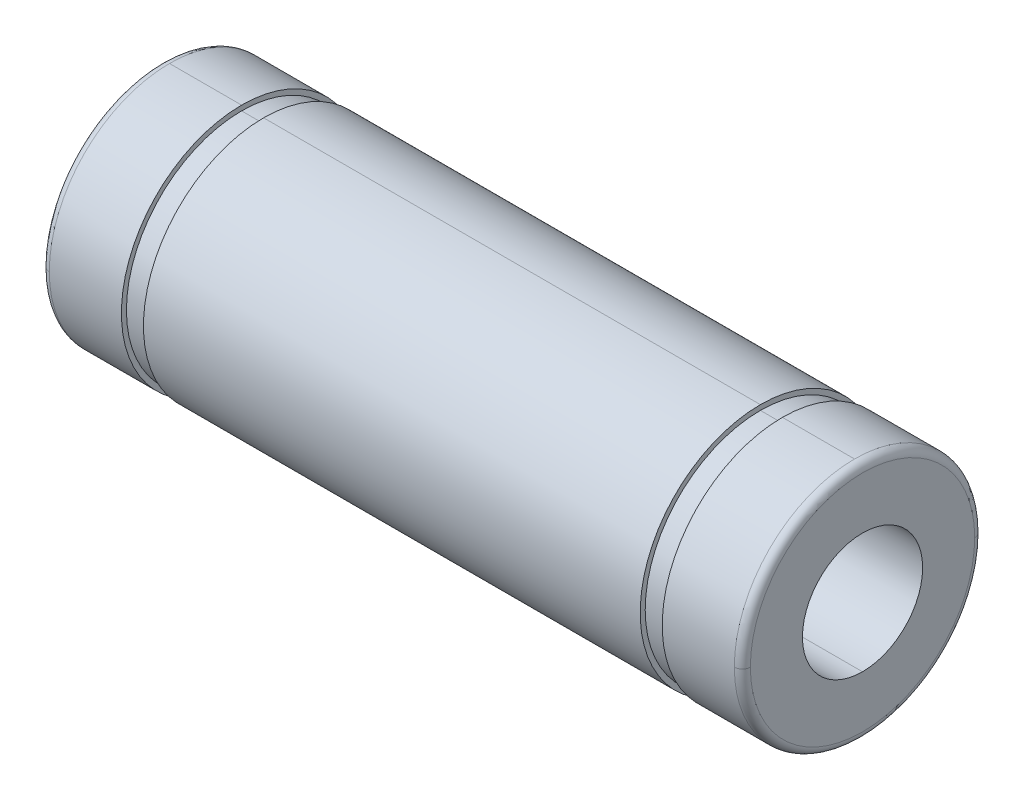
ISO-10303-21;
HEADER;
FILE_DESCRIPTION(('STEP AP214'),'2;1');
FILE_NAME('part.step','',(''),(''),'','','');
FILE_SCHEMA(('AUTOMOTIVE_DESIGN { 1 0 10303 214 1 1 1 1 }'));
ENDSEC;
DATA;
#1=APPLICATION_CONTEXT('core data for automotive mechanical design processes');
#2=APPLICATION_PROTOCOL_DEFINITION('international standard','automotive_design',2000,#1);
#3=PRODUCT_CONTEXT('',#1,'mechanical');
#4=PRODUCT('Part','Part','',(#3));
#5=PRODUCT_RELATED_PRODUCT_CATEGORY('part','',(#4));
#6=PRODUCT_DEFINITION_FORMATION('','',#4);
#7=PRODUCT_DEFINITION_CONTEXT('part definition',#1,'design');
#8=PRODUCT_DEFINITION('design','',#6,#7);
#9=PRODUCT_DEFINITION_SHAPE('','',#8);
#10=(LENGTH_UNIT() NAMED_UNIT(*) SI_UNIT(.MILLI.,.METRE.));
#11=(NAMED_UNIT(*) PLANE_ANGLE_UNIT() SI_UNIT($,.RADIAN.));
#12=(NAMED_UNIT(*) SI_UNIT($,.STERADIAN.) SOLID_ANGLE_UNIT());
#13=UNCERTAINTY_MEASURE_WITH_UNIT(LENGTH_MEASURE(1.E-05),#10,'distance_accuracy_value','');
#14=(GEOMETRIC_REPRESENTATION_CONTEXT(3) GLOBAL_UNCERTAINTY_ASSIGNED_CONTEXT((#13)) GLOBAL_UNIT_ASSIGNED_CONTEXT((#10,
#11,#12)) REPRESENTATION_CONTEXT('',''));
#15=CARTESIAN_POINT('',(0.,0.,0.));
#16=DIRECTION('',(0.,0.,1.));
#17=DIRECTION('',(1.,0.,0.));
#18=AXIS2_PLACEMENT_3D('',#15,#16,#17);
#19=CARTESIAN_POINT('',(-17.1,0.,0.));
#20=DIRECTION('',(1.,0.,0.));
#21=DIRECTION('',(0.,0.,-1.));
#22=AXIS2_PLACEMENT_3D('',#19,#20,#21);
#23=TOROIDAL_SURFACE('',#22,5.6,0.4);
#24=CARTESIAN_POINT('',(-17.1,0.,-5.6));
#25=DIRECTION('',(0.,-1.,0.));
#26=DIRECTION('',(0.,0.,-1.));
#27=AXIS2_PLACEMENT_3D('',#24,#25,#26);
#28=CIRCLE('',#27,0.4);
#29=CARTESIAN_POINT('',(-17.5,0.,-5.6));
#30=VERTEX_POINT('',#29);
#31=CARTESIAN_POINT('',(-17.1,0.,-6.));
#32=VERTEX_POINT('',#31);
#33=EDGE_CURVE('E222',#30,#32,#28,.T.);
#34=ORIENTED_EDGE('',*,*,#33,.T.);
#35=CARTESIAN_POINT('',(-17.1,0.,0.));
#36=DIRECTION('',(1.,0.,0.));
#37=DIRECTION('',(0.,1.,0.));
#38=AXIS2_PLACEMENT_3D('',#35,#36,#37);
#39=CIRCLE('',#38,6.);
#40=CARTESIAN_POINT('',(-17.1,-6.,0.));
#41=VERTEX_POINT('',#40);
#42=EDGE_CURVE('E70',#41,#32,#39,.T.);
#43=ORIENTED_EDGE('',*,*,#42,.F.);
#44=CARTESIAN_POINT('',(-17.1,0.,0.));
#45=DIRECTION('',(1.,0.,0.));
#46=DIRECTION('',(0.,1.,0.));
#47=AXIS2_PLACEMENT_3D('',#44,#45,#46);
#48=CIRCLE('',#47,6.);
#49=CARTESIAN_POINT('',(-17.1,0.,6.));
#50=VERTEX_POINT('',#49);
#51=EDGE_CURVE('E305',#50,#41,#48,.T.);
#52=ORIENTED_EDGE('',*,*,#51,.F.);
#53=CARTESIAN_POINT('',(-17.1,0.,5.6));
#54=DIRECTION('',(0.,-1.,0.));
#55=DIRECTION('',(0.,0.,1.));
#56=AXIS2_PLACEMENT_3D('',#53,#54,#55);
#57=CIRCLE('',#56,0.4);
#58=CARTESIAN_POINT('',(-17.5,0.,5.6));
#59=VERTEX_POINT('',#58);
#60=EDGE_CURVE('E304',#50,#59,#57,.T.);
#61=ORIENTED_EDGE('',*,*,#60,.T.);
#62=CARTESIAN_POINT('',(-17.5,0.,0.));
#63=DIRECTION('',(1.,0.,0.));
#64=DIRECTION('',(0.,1.,0.));
#65=AXIS2_PLACEMENT_3D('',#62,#63,#64);
#66=CIRCLE('',#65,5.6);
#67=EDGE_CURVE('E11',#59,#30,#66,.T.);
#68=ORIENTED_EDGE('',*,*,#67,.T.);
#69=EDGE_LOOP('',(#34,#43,#52,#61,#68));
#70=FACE_BOUND('',#69,.T.);
#71=ADVANCED_FACE('F16',(#70),#23,.T.);
#72=CARTESIAN_POINT('',(-17.5,4.3,0.));
#73=DIRECTION('',(-1.,0.,0.));
#74=DIRECTION('',(0.,0.,1.));
#75=AXIS2_PLACEMENT_3D('',#72,#73,#74);
#76=PLANE('',#75);
#77=CARTESIAN_POINT('',(-17.5,0.,0.));
#78=DIRECTION('',(1.,0.,0.));
#79=DIRECTION('',(0.,1.,0.));
#80=AXIS2_PLACEMENT_3D('',#77,#78,#79);
#81=CIRCLE('',#80,3.);
#82=CARTESIAN_POINT('',(-17.5,3.,0.));
#83=VERTEX_POINT('',#82);
#84=CARTESIAN_POINT('',(-17.5,-3.,0.));
#85=VERTEX_POINT('',#84);
#86=EDGE_CURVE('E27',#83,#85,#81,.T.);
#87=ORIENTED_EDGE('',*,*,#86,.T.);
#88=CARTESIAN_POINT('',(-17.5,0.,0.));
#89=DIRECTION('',(1.,0.,0.));
#90=DIRECTION('',(0.,1.,0.));
#91=AXIS2_PLACEMENT_3D('',#88,#89,#90);
#92=CIRCLE('',#91,3.);
#93=EDGE_CURVE('E291',#85,#83,#92,.T.);
#94=ORIENTED_EDGE('',*,*,#93,.T.);
#95=EDGE_LOOP('',(#87,#94));
#96=FACE_BOUND('',#95,.T.);
#97=CARTESIAN_POINT('',(-17.5,0.,0.));
#98=DIRECTION('',(1.,0.,0.));
#99=DIRECTION('',(0.,1.,0.));
#100=AXIS2_PLACEMENT_3D('',#97,#98,#99);
#101=CIRCLE('',#100,5.6);
#102=CARTESIAN_POINT('',(-17.5,5.6,0.));
#103=VERTEX_POINT('',#102);
#104=EDGE_CURVE('E221',#103,#59,#101,.T.);
#105=ORIENTED_EDGE('',*,*,#104,.F.);
#106=CARTESIAN_POINT('',(-17.5,0.,0.));
#107=DIRECTION('',(1.,0.,0.));
#108=DIRECTION('',(0.,1.,0.));
#109=AXIS2_PLACEMENT_3D('',#106,#107,#108);
#110=CIRCLE('',#109,5.6);
#111=EDGE_CURVE('E218',#30,#103,#110,.T.);
#112=ORIENTED_EDGE('',*,*,#111,.F.);
#113=ORIENTED_EDGE('',*,*,#67,.F.);
#114=EDGE_LOOP('',(#105,#112,#113));
#115=FACE_BOUND('',#114,.T.);
#116=ADVANCED_FACE('F423',(#96,#115),#76,.T.);
#117=CARTESIAN_POINT('',(0.,0.,0.));
#118=DIRECTION('',(1.,0.,0.));
#119=DIRECTION('',(0.,1.,0.));
#120=AXIS2_PLACEMENT_3D('',#117,#118,#119);
#121=CYLINDRICAL_SURFACE('',#120,3.);
#122=DIRECTION('',(1.,0.,0.));
#123=VECTOR('',#122,1.);
#124=CARTESIAN_POINT('',(0.,3.,0.));
#125=LINE('',#124,#123);
#126=CARTESIAN_POINT('',(17.5,3.,0.));
#127=VERTEX_POINT('',#126);
#128=EDGE_CURVE('E295',#83,#127,#125,.T.);
#129=ORIENTED_EDGE('',*,*,#128,.T.);
#130=CARTESIAN_POINT('',(17.5,0.,0.));
#131=DIRECTION('',(1.,0.,0.));
#132=DIRECTION('',(0.,1.,0.));
#133=AXIS2_PLACEMENT_3D('',#130,#131,#132);
#134=CIRCLE('',#133,3.);
#135=CARTESIAN_POINT('',(17.5,-3.,0.));
#136=VERTEX_POINT('',#135);
#137=EDGE_CURVE('E281',#127,#136,#134,.T.);
#138=ORIENTED_EDGE('',*,*,#137,.T.);
#139=DIRECTION('',(-1.,0.,0.));
#140=VECTOR('',#139,1.);
#141=CARTESIAN_POINT('',(0.,-3.,0.));
#142=LINE('',#141,#140);
#143=EDGE_CURVE('E20',#136,#85,#142,.T.);
#144=ORIENTED_EDGE('',*,*,#143,.T.);
#145=ORIENTED_EDGE('',*,*,#86,.F.);
#146=EDGE_LOOP('',(#129,#138,#144,#145));
#147=FACE_BOUND('',#146,.T.);
#148=ADVANCED_FACE('F427',(#147),#121,.F.);
#149=CARTESIAN_POINT('',(17.5,4.3,0.));
#150=DIRECTION('',(1.,0.,0.));
#151=DIRECTION('',(0.,1.,0.));
#152=AXIS2_PLACEMENT_3D('',#149,#150,#151);
#153=PLANE('',#152);
#154=ORIENTED_EDGE('',*,*,#137,.F.);
#155=CARTESIAN_POINT('',(17.5,0.,0.));
#156=DIRECTION('',(1.,0.,0.));
#157=DIRECTION('',(0.,1.,0.));
#158=AXIS2_PLACEMENT_3D('',#155,#156,#157);
#159=CIRCLE('',#158,3.);
#160=EDGE_CURVE('E246',#136,#127,#159,.T.);
#161=ORIENTED_EDGE('',*,*,#160,.F.);
#162=EDGE_LOOP('',(#154,#161));
#163=FACE_BOUND('',#162,.T.);
#164=CARTESIAN_POINT('',(17.5,0.,0.));
#165=DIRECTION('',(1.,0.,0.));
#166=DIRECTION('',(0.,1.,0.));
#167=AXIS2_PLACEMENT_3D('',#164,#165,#166);
#168=CIRCLE('',#167,5.6);
#169=CARTESIAN_POINT('',(17.5,5.6,0.));
#170=VERTEX_POINT('',#169);
#171=CARTESIAN_POINT('',(17.5,0.,5.6));
#172=VERTEX_POINT('',#171);
#173=EDGE_CURVE('E377',#170,#172,#168,.T.);
#174=ORIENTED_EDGE('',*,*,#173,.T.);
#175=CARTESIAN_POINT('',(17.5,0.,0.));
#176=DIRECTION('',(1.,0.,0.));
#177=DIRECTION('',(0.,1.,0.));
#178=AXIS2_PLACEMENT_3D('',#175,#176,#177);
#179=CIRCLE('',#178,5.6);
#180=CARTESIAN_POINT('',(17.5,0.,-5.6));
#181=VERTEX_POINT('',#180);
#182=EDGE_CURVE('E278',#172,#181,#179,.T.);
#183=ORIENTED_EDGE('',*,*,#182,.T.);
#184=CARTESIAN_POINT('',(17.5,0.,0.));
#185=DIRECTION('',(1.,0.,0.));
#186=DIRECTION('',(0.,1.,0.));
#187=AXIS2_PLACEMENT_3D('',#184,#185,#186);
#188=CIRCLE('',#187,5.6);
#189=EDGE_CURVE('E374',#181,#170,#188,.T.);
#190=ORIENTED_EDGE('',*,*,#189,.T.);
#191=EDGE_LOOP('',(#174,#183,#190));
#192=FACE_BOUND('',#191,.T.);
#193=ADVANCED_FACE('F18',(#163,#192),#153,.T.);
#194=CARTESIAN_POINT('',(17.1,0.,0.));
#195=DIRECTION('',(1.,0.,0.));
#196=DIRECTION('',(0.,0.,-1.));
#197=AXIS2_PLACEMENT_3D('',#194,#195,#196);
#198=TOROIDAL_SURFACE('',#197,5.6,0.4);
#199=CARTESIAN_POINT('',(17.1,0.,-5.6));
#200=DIRECTION('',(0.,-1.,0.));
#201=DIRECTION('',(0.,0.,-1.));
#202=AXIS2_PLACEMENT_3D('',#199,#200,#201);
#203=CIRCLE('',#202,0.4);
#204=CARTESIAN_POINT('',(17.1,0.,-6.));
#205=VERTEX_POINT('',#204);
#206=EDGE_CURVE('E250',#205,#181,#203,.T.);
#207=ORIENTED_EDGE('',*,*,#206,.T.);
#208=ORIENTED_EDGE('',*,*,#182,.F.);
#209=CARTESIAN_POINT('',(17.1,0.,5.6));
#210=DIRECTION('',(0.,-1.,0.));
#211=DIRECTION('',(0.,0.,1.));
#212=AXIS2_PLACEMENT_3D('',#209,#210,#211);
#213=CIRCLE('',#212,0.4);
#214=CARTESIAN_POINT('',(17.1,0.,6.));
#215=VERTEX_POINT('',#214);
#216=EDGE_CURVE('E244',#172,#215,#213,.T.);
#217=ORIENTED_EDGE('',*,*,#216,.T.);
#218=CARTESIAN_POINT('',(17.1,0.,0.));
#219=DIRECTION('',(1.,0.,0.));
#220=DIRECTION('',(0.,1.,0.));
#221=AXIS2_PLACEMENT_3D('',#218,#219,#220);
#222=CIRCLE('',#221,6.);
#223=CARTESIAN_POINT('',(17.1,-6.,0.));
#224=VERTEX_POINT('',#223);
#225=EDGE_CURVE('E201',#215,#224,#222,.T.);
#226=ORIENTED_EDGE('',*,*,#225,.T.);
#227=CARTESIAN_POINT('',(17.1,0.,0.));
#228=DIRECTION('',(1.,0.,0.));
#229=DIRECTION('',(0.,1.,0.));
#230=AXIS2_PLACEMENT_3D('',#227,#228,#229);
#231=CIRCLE('',#230,6.);
#232=EDGE_CURVE('E168',#224,#205,#231,.T.);
#233=ORIENTED_EDGE('',*,*,#232,.T.);
#234=EDGE_LOOP('',(#207,#208,#217,#226,#233));
#235=FACE_BOUND('',#234,.T.);
#236=ADVANCED_FACE('F405',(#235),#198,.T.);
#237=CARTESIAN_POINT('',(0.,0.,0.));
#238=DIRECTION('',(1.,0.,0.));
#239=DIRECTION('',(0.,1.,0.));
#240=AXIS2_PLACEMENT_3D('',#237,#238,#239);
#241=CYLINDRICAL_SURFACE('',#240,6.);
#242=DIRECTION('',(1.,0.,0.));
#243=VECTOR('',#242,1.);
#244=CARTESIAN_POINT('',(-15.3,6.,0.));
#245=LINE('',#244,#243);
#246=CARTESIAN_POINT('',(-17.1,6.,0.));
#247=VERTEX_POINT('',#246);
#248=CARTESIAN_POINT('',(-13.5,6.,0.));
#249=VERTEX_POINT('',#248);
#250=EDGE_CURVE('E310',#247,#249,#245,.T.);
#251=ORIENTED_EDGE('',*,*,#250,.T.);
#252=CARTESIAN_POINT('',(-13.5,0.,0.));
#253=DIRECTION('',(-1.,0.,0.));
#254=DIRECTION('',(0.,1.,0.));
#255=AXIS2_PLACEMENT_3D('',#252,#253,#254);
#256=CIRCLE('',#255,6.);
#257=CARTESIAN_POINT('',(-13.5,-6.,0.));
#258=VERTEX_POINT('',#257);
#259=EDGE_CURVE('E84',#249,#258,#256,.T.);
#260=ORIENTED_EDGE('',*,*,#259,.T.);
#261=DIRECTION('',(-1.,0.,0.));
#262=VECTOR('',#261,1.);
#263=CARTESIAN_POINT('',(-15.3,-6.,0.));
#264=LINE('',#263,#262);
#265=EDGE_CURVE('E309',#258,#41,#264,.T.);
#266=ORIENTED_EDGE('',*,*,#265,.T.);
#267=ORIENTED_EDGE('',*,*,#42,.T.);
#268=CARTESIAN_POINT('',(-17.1,0.,0.));
#269=DIRECTION('',(1.,0.,0.));
#270=DIRECTION('',(0.,1.,0.));
#271=AXIS2_PLACEMENT_3D('',#268,#269,#270);
#272=CIRCLE('',#271,6.);
#273=EDGE_CURVE('E303',#32,#247,#272,.T.);
#274=ORIENTED_EDGE('',*,*,#273,.T.);
#275=EDGE_LOOP('',(#251,#260,#266,#267,#274));
#276=FACE_BOUND('',#275,.T.);
#277=ADVANCED_FACE('F435',(#276),#241,.T.);
#278=CARTESIAN_POINT('',(0.,0.,0.));
#279=DIRECTION('',(1.,0.,0.));
#280=DIRECTION('',(0.,1.,0.));
#281=AXIS2_PLACEMENT_3D('',#278,#279,#280);
#282=CYLINDRICAL_SURFACE('',#281,6.);
#283=DIRECTION('',(1.,0.,0.));
#284=VECTOR('',#283,1.);
#285=CARTESIAN_POINT('',(0.,6.,0.));
#286=LINE('',#285,#284);
#287=CARTESIAN_POINT('',(-12.4,6.,0.));
#288=VERTEX_POINT('',#287);
#289=CARTESIAN_POINT('',(12.4,6.,0.));
#290=VERTEX_POINT('',#289);
#291=EDGE_CURVE('E256',#288,#290,#286,.T.);
#292=ORIENTED_EDGE('',*,*,#291,.T.);
#293=CARTESIAN_POINT('',(12.4,0.,0.));
#294=DIRECTION('',(-1.,0.,0.));
#295=DIRECTION('',(0.,1.,0.));
#296=AXIS2_PLACEMENT_3D('',#293,#294,#295);
#297=CIRCLE('',#296,6.);
#298=CARTESIAN_POINT('',(12.4,-6.,0.));
#299=VERTEX_POINT('',#298);
#300=EDGE_CURVE('E187',#290,#299,#297,.T.);
#301=ORIENTED_EDGE('',*,*,#300,.T.);
#302=DIRECTION('',(-1.,0.,0.));
#303=VECTOR('',#302,1.);
#304=CARTESIAN_POINT('',(0.,-6.,0.));
#305=LINE('',#304,#303);
#306=CARTESIAN_POINT('',(-12.4,-6.,0.));
#307=VERTEX_POINT('',#306);
#308=EDGE_CURVE('E211',#299,#307,#305,.T.);
#309=ORIENTED_EDGE('',*,*,#308,.T.);
#310=CARTESIAN_POINT('',(-12.4,0.,0.));
#311=DIRECTION('',(1.,0.,0.));
#312=DIRECTION('',(0.,1.,0.));
#313=AXIS2_PLACEMENT_3D('',#310,#311,#312);
#314=CIRCLE('',#313,6.);
#315=EDGE_CURVE('E214',#307,#288,#314,.T.);
#316=ORIENTED_EDGE('',*,*,#315,.T.);
#317=EDGE_LOOP('',(#292,#301,#309,#316));
#318=FACE_BOUND('',#317,.T.);
#319=ADVANCED_FACE('F438',(#318),#282,.T.);
#320=CARTESIAN_POINT('',(0.,0.,0.));
#321=DIRECTION('',(1.,0.,0.));
#322=DIRECTION('',(0.,1.,0.));
#323=AXIS2_PLACEMENT_3D('',#320,#321,#322);
#324=CYLINDRICAL_SURFACE('',#323,6.);
#325=DIRECTION('',(1.,0.,0.));
#326=VECTOR('',#325,1.);
#327=CARTESIAN_POINT('',(15.3,6.,0.));
#328=LINE('',#327,#326);
#329=CARTESIAN_POINT('',(13.5,6.,0.));
#330=VERTEX_POINT('',#329);
#331=CARTESIAN_POINT('',(17.1,6.,0.));
#332=VERTEX_POINT('',#331);
#333=EDGE_CURVE('E231',#330,#332,#328,.T.);
#334=ORIENTED_EDGE('',*,*,#333,.T.);
#335=CARTESIAN_POINT('',(17.1,0.,0.));
#336=DIRECTION('',(1.,0.,0.));
#337=DIRECTION('',(0.,1.,0.));
#338=AXIS2_PLACEMENT_3D('',#335,#336,#337);
#339=CIRCLE('',#338,6.);
#340=EDGE_CURVE('E288',#205,#332,#339,.T.);
#341=ORIENTED_EDGE('',*,*,#340,.F.);
#342=ORIENTED_EDGE('',*,*,#232,.F.);
#343=DIRECTION('',(-1.,0.,0.));
#344=VECTOR('',#343,1.);
#345=CARTESIAN_POINT('',(15.3,-6.,0.));
#346=LINE('',#345,#344);
#347=CARTESIAN_POINT('',(13.5,-6.,0.));
#348=VERTEX_POINT('',#347);
#349=EDGE_CURVE('E207',#224,#348,#346,.T.);
#350=ORIENTED_EDGE('',*,*,#349,.T.);
#351=CARTESIAN_POINT('',(13.5,0.,0.));
#352=DIRECTION('',(1.,0.,0.));
#353=DIRECTION('',(0.,1.,0.));
#354=AXIS2_PLACEMENT_3D('',#351,#352,#353);
#355=CIRCLE('',#354,6.);
#356=EDGE_CURVE('E217',#348,#330,#355,.T.);
#357=ORIENTED_EDGE('',*,*,#356,.T.);
#358=EDGE_LOOP('',(#334,#341,#342,#350,#357));
#359=FACE_BOUND('',#358,.T.);
#360=ADVANCED_FACE('F406',(#359),#324,.T.);
#361=CARTESIAN_POINT('',(13.5,5.875,0.));
#362=DIRECTION('',(1.,0.,0.));
#363=DIRECTION('',(0.,1.,0.));
#364=AXIS2_PLACEMENT_3D('',#361,#362,#363);
#365=PLANE('',#364);
#366=CARTESIAN_POINT('',(13.5,0.,0.));
#367=DIRECTION('',(1.,0.,0.));
#368=DIRECTION('',(0.,1.,0.));
#369=AXIS2_PLACEMENT_3D('',#366,#367,#368);
#370=CIRCLE('',#369,5.75);
#371=CARTESIAN_POINT('',(13.5,5.75,0.));
#372=VERTEX_POINT('',#371);
#373=CARTESIAN_POINT('',(13.5,-5.75,0.));
#374=VERTEX_POINT('',#373);
#375=EDGE_CURVE('E177',#372,#374,#370,.T.);
#376=ORIENTED_EDGE('',*,*,#375,.T.);
#377=CARTESIAN_POINT('',(13.5,0.,0.));
#378=DIRECTION('',(1.,0.,0.));
#379=DIRECTION('',(0.,1.,0.));
#380=AXIS2_PLACEMENT_3D('',#377,#378,#379);
#381=CIRCLE('',#380,5.75);
#382=EDGE_CURVE('E190',#374,#372,#381,.T.);
#383=ORIENTED_EDGE('',*,*,#382,.T.);
#384=EDGE_LOOP('',(#376,#383));
#385=FACE_BOUND('',#384,.T.);
#386=CARTESIAN_POINT('',(13.5,0.,0.));
#387=DIRECTION('',(1.,0.,0.));
#388=DIRECTION('',(0.,1.,0.));
#389=AXIS2_PLACEMENT_3D('',#386,#387,#388);
#390=CIRCLE('',#389,6.);
#391=EDGE_CURVE('E224',#330,#348,#390,.T.);
#392=ORIENTED_EDGE('',*,*,#391,.F.);
#393=ORIENTED_EDGE('',*,*,#356,.F.);
#394=EDGE_LOOP('',(#392,#393));
#395=FACE_BOUND('',#394,.T.);
#396=ADVANCED_FACE('F191',(#385,#395),#365,.F.);
#397=CARTESIAN_POINT('',(12.4,5.875,0.));
#398=DIRECTION('',(-1.,0.,0.));
#399=DIRECTION('',(0.,0.,1.));
#400=AXIS2_PLACEMENT_3D('',#397,#398,#399);
#401=PLANE('',#400);
#402=CARTESIAN_POINT('',(12.4,0.,0.));
#403=DIRECTION('',(1.,0.,0.));
#404=DIRECTION('',(0.,1.,0.));
#405=AXIS2_PLACEMENT_3D('',#402,#403,#404);
#406=CIRCLE('',#405,5.75);
#407=CARTESIAN_POINT('',(12.4,5.75,0.));
#408=VERTEX_POINT('',#407);
#409=CARTESIAN_POINT('',(12.4,-5.75,0.));
#410=VERTEX_POINT('',#409);
#411=EDGE_CURVE('E188',#408,#410,#406,.T.);
#412=ORIENTED_EDGE('',*,*,#411,.F.);
#413=CARTESIAN_POINT('',(12.4,0.,0.));
#414=DIRECTION('',(1.,0.,0.));
#415=DIRECTION('',(0.,1.,0.));
#416=AXIS2_PLACEMENT_3D('',#413,#414,#415);
#417=CIRCLE('',#416,5.75);
#418=EDGE_CURVE('E199',#410,#408,#417,.T.);
#419=ORIENTED_EDGE('',*,*,#418,.F.);
#420=EDGE_LOOP('',(#412,#419));
#421=FACE_BOUND('',#420,.T.);
#422=ORIENTED_EDGE('',*,*,#300,.F.);
#423=CARTESIAN_POINT('',(12.4,0.,0.));
#424=DIRECTION('',(-1.,0.,0.));
#425=DIRECTION('',(0.,1.,0.));
#426=AXIS2_PLACEMENT_3D('',#423,#424,#425);
#427=CIRCLE('',#426,6.);
#428=EDGE_CURVE('E240',#299,#290,#427,.T.);
#429=ORIENTED_EDGE('',*,*,#428,.F.);
#430=EDGE_LOOP('',(#422,#429));
#431=FACE_BOUND('',#430,.T.);
#432=ADVANCED_FACE('F433',(#421,#431),#401,.F.);
#433=CARTESIAN_POINT('',(12.95,0.,0.));
#434=DIRECTION('',(1.,0.,0.));
#435=DIRECTION('',(0.,1.,0.));
#436=AXIS2_PLACEMENT_3D('',#433,#434,#435);
#437=CYLINDRICAL_SURFACE('',#436,5.75);
#438=DIRECTION('',(-1.,0.,0.));
#439=VECTOR('',#438,1.);
#440=CARTESIAN_POINT('',(12.95,5.75,0.));
#441=LINE('',#440,#439);
#442=EDGE_CURVE('E181',#372,#408,#441,.T.);
#443=ORIENTED_EDGE('',*,*,#442,.T.);
#444=ORIENTED_EDGE('',*,*,#411,.T.);
#445=DIRECTION('',(1.,0.,0.));
#446=VECTOR('',#445,1.);
#447=CARTESIAN_POINT('',(12.95,-5.75,0.));
#448=LINE('',#447,#446);
#449=EDGE_CURVE('E183',#410,#374,#448,.T.);
#450=ORIENTED_EDGE('',*,*,#449,.T.);
#451=ORIENTED_EDGE('',*,*,#375,.F.);
#452=EDGE_LOOP('',(#443,#444,#450,#451));
#453=FACE_BOUND('',#452,.T.);
#454=ADVANCED_FACE('F179',(#453),#437,.T.);
#455=CARTESIAN_POINT('',(-13.5,5.875,0.));
#456=DIRECTION('',(-1.,0.,0.));
#457=DIRECTION('',(0.,0.,1.));
#458=AXIS2_PLACEMENT_3D('',#455,#456,#457);
#459=PLANE('',#458);
#460=CARTESIAN_POINT('',(-13.5,0.,0.));
#461=DIRECTION('',(1.,0.,0.));
#462=DIRECTION('',(0.,1.,0.));
#463=AXIS2_PLACEMENT_3D('',#460,#461,#462);
#464=CIRCLE('',#463,5.75);
#465=CARTESIAN_POINT('',(-13.5,5.75,0.));
#466=VERTEX_POINT('',#465);
#467=CARTESIAN_POINT('',(-13.5,-5.75,0.));
#468=VERTEX_POINT('',#467);
#469=EDGE_CURVE('E41',#466,#468,#464,.T.);
#470=ORIENTED_EDGE('',*,*,#469,.F.);
#471=CARTESIAN_POINT('',(-13.5,0.,0.));
#472=DIRECTION('',(1.,0.,0.));
#473=DIRECTION('',(0.,1.,0.));
#474=AXIS2_PLACEMENT_3D('',#471,#472,#473);
#475=CIRCLE('',#474,5.75);
#476=EDGE_CURVE('E345',#468,#466,#475,.T.);
#477=ORIENTED_EDGE('',*,*,#476,.F.);
#478=EDGE_LOOP('',(#470,#477));
#479=FACE_BOUND('',#478,.T.);
#480=ORIENTED_EDGE('',*,*,#259,.F.);
#481=CARTESIAN_POINT('',(-13.5,0.,0.));
#482=DIRECTION('',(-1.,0.,0.));
#483=DIRECTION('',(0.,1.,0.));
#484=AXIS2_PLACEMENT_3D('',#481,#482,#483);
#485=CIRCLE('',#484,6.);
#486=EDGE_CURVE('E333',#258,#249,#485,.T.);
#487=ORIENTED_EDGE('',*,*,#486,.F.);
#488=EDGE_LOOP('',(#480,#487));
#489=FACE_BOUND('',#488,.T.);
#490=ADVANCED_FACE('F432',(#479,#489),#459,.F.);
#491=CARTESIAN_POINT('',(-12.4,5.875,0.));
#492=DIRECTION('',(1.,0.,0.));
#493=DIRECTION('',(0.,1.,0.));
#494=AXIS2_PLACEMENT_3D('',#491,#492,#493);
#495=PLANE('',#494);
#496=CARTESIAN_POINT('',(-12.4,0.,0.));
#497=DIRECTION('',(1.,0.,0.));
#498=DIRECTION('',(0.,1.,0.));
#499=AXIS2_PLACEMENT_3D('',#496,#497,#498);
#500=CIRCLE('',#499,5.75);
#501=CARTESIAN_POINT('',(-12.4,5.75,0.));
#502=VERTEX_POINT('',#501);
#503=CARTESIAN_POINT('',(-12.4,-5.75,0.));
#504=VERTEX_POINT('',#503);
#505=EDGE_CURVE('E271',#502,#504,#500,.T.);
#506=ORIENTED_EDGE('',*,*,#505,.T.);
#507=CARTESIAN_POINT('',(-12.4,0.,0.));
#508=DIRECTION('',(1.,0.,0.));
#509=DIRECTION('',(0.,1.,0.));
#510=AXIS2_PLACEMENT_3D('',#507,#508,#509);
#511=CIRCLE('',#510,5.75);
#512=EDGE_CURVE('E273',#504,#502,#511,.T.);
#513=ORIENTED_EDGE('',*,*,#512,.T.);
#514=EDGE_LOOP('',(#506,#513));
#515=FACE_BOUND('',#514,.T.);
#516=CARTESIAN_POINT('',(-12.4,0.,0.));
#517=DIRECTION('',(1.,0.,0.));
#518=DIRECTION('',(0.,1.,0.));
#519=AXIS2_PLACEMENT_3D('',#516,#517,#518);
#520=CIRCLE('',#519,6.);
#521=EDGE_CURVE('E253',#288,#307,#520,.T.);
#522=ORIENTED_EDGE('',*,*,#521,.F.);
#523=ORIENTED_EDGE('',*,*,#315,.F.);
#524=EDGE_LOOP('',(#522,#523));
#525=FACE_BOUND('',#524,.T.);
#526=ADVANCED_FACE('F360',(#515,#525),#495,.F.);
#527=CARTESIAN_POINT('',(-12.95,0.,0.));
#528=DIRECTION('',(1.,0.,0.));
#529=DIRECTION('',(0.,1.,0.));
#530=AXIS2_PLACEMENT_3D('',#527,#528,#529);
#531=CYLINDRICAL_SURFACE('',#530,5.75);
#532=DIRECTION('',(-1.,0.,0.));
#533=VECTOR('',#532,1.);
#534=CARTESIAN_POINT('',(-12.95,5.75,0.));
#535=LINE('',#534,#533);
#536=EDGE_CURVE('E277',#502,#466,#535,.T.);
#537=ORIENTED_EDGE('',*,*,#536,.T.);
#538=ORIENTED_EDGE('',*,*,#469,.T.);
#539=DIRECTION('',(1.,0.,0.));
#540=VECTOR('',#539,1.);
#541=CARTESIAN_POINT('',(-12.95,-5.75,0.));
#542=LINE('',#541,#540);
#543=EDGE_CURVE('E276',#468,#504,#542,.T.);
#544=ORIENTED_EDGE('',*,*,#543,.T.);
#545=ORIENTED_EDGE('',*,*,#505,.F.);
#546=EDGE_LOOP('',(#537,#538,#544,#545));
#547=FACE_BOUND('',#546,.T.);
#548=ADVANCED_FACE('F357',(#547),#531,.T.);
#549=CARTESIAN_POINT('',(-12.95,0.,0.));
#550=DIRECTION('',(1.,0.,0.));
#551=DIRECTION('',(0.,1.,0.));
#552=AXIS2_PLACEMENT_3D('',#549,#550,#551);
#553=CYLINDRICAL_SURFACE('',#552,5.75);
#554=ORIENTED_EDGE('',*,*,#536,.F.);
#555=ORIENTED_EDGE('',*,*,#512,.F.);
#556=ORIENTED_EDGE('',*,*,#543,.F.);
#557=ORIENTED_EDGE('',*,*,#476,.T.);
#558=EDGE_LOOP('',(#554,#555,#556,#557));
#559=FACE_BOUND('',#558,.T.);
#560=ADVANCED_FACE('F358',(#559),#553,.T.);
#561=CARTESIAN_POINT('',(12.95,0.,0.));
#562=DIRECTION('',(1.,0.,0.));
#563=DIRECTION('',(0.,1.,0.));
#564=AXIS2_PLACEMENT_3D('',#561,#562,#563);
#565=CYLINDRICAL_SURFACE('',#564,5.75);
#566=ORIENTED_EDGE('',*,*,#442,.F.);
#567=ORIENTED_EDGE('',*,*,#382,.F.);
#568=ORIENTED_EDGE('',*,*,#449,.F.);
#569=ORIENTED_EDGE('',*,*,#418,.T.);
#570=EDGE_LOOP('',(#566,#567,#568,#569));
#571=FACE_BOUND('',#570,.T.);
#572=ADVANCED_FACE('F197',(#571),#565,.T.);
#573=CARTESIAN_POINT('',(0.,0.,0.));
#574=DIRECTION('',(1.,0.,0.));
#575=DIRECTION('',(0.,1.,0.));
#576=AXIS2_PLACEMENT_3D('',#573,#574,#575);
#577=CYLINDRICAL_SURFACE('',#576,6.);
#578=ORIENTED_EDGE('',*,*,#333,.F.);
#579=ORIENTED_EDGE('',*,*,#391,.T.);
#580=ORIENTED_EDGE('',*,*,#349,.F.);
#581=ORIENTED_EDGE('',*,*,#225,.F.);
#582=CARTESIAN_POINT('',(17.1,0.,0.));
#583=DIRECTION('',(1.,0.,0.));
#584=DIRECTION('',(0.,1.,0.));
#585=AXIS2_PLACEMENT_3D('',#582,#583,#584);
#586=CIRCLE('',#585,6.);
#587=EDGE_CURVE('E284',#332,#215,#586,.T.);
#588=ORIENTED_EDGE('',*,*,#587,.F.);
#589=EDGE_LOOP('',(#578,#579,#580,#581,#588));
#590=FACE_BOUND('',#589,.T.);
#591=ADVANCED_FACE('F407',(#590),#577,.T.);
#592=CARTESIAN_POINT('',(0.,0.,0.));
#593=DIRECTION('',(1.,0.,0.));
#594=DIRECTION('',(0.,1.,0.));
#595=AXIS2_PLACEMENT_3D('',#592,#593,#594);
#596=CYLINDRICAL_SURFACE('',#595,6.);
#597=ORIENTED_EDGE('',*,*,#291,.F.);
#598=ORIENTED_EDGE('',*,*,#521,.T.);
#599=ORIENTED_EDGE('',*,*,#308,.F.);
#600=ORIENTED_EDGE('',*,*,#428,.T.);
#601=EDGE_LOOP('',(#597,#598,#599,#600));
#602=FACE_BOUND('',#601,.T.);
#603=ADVANCED_FACE('F409',(#602),#596,.T.);
#604=CARTESIAN_POINT('',(0.,0.,0.));
#605=DIRECTION('',(1.,0.,0.));
#606=DIRECTION('',(0.,1.,0.));
#607=AXIS2_PLACEMENT_3D('',#604,#605,#606);
#608=CYLINDRICAL_SURFACE('',#607,6.);
#609=ORIENTED_EDGE('',*,*,#250,.F.);
#610=CARTESIAN_POINT('',(-17.1,0.,0.));
#611=DIRECTION('',(1.,0.,0.));
#612=DIRECTION('',(0.,1.,0.));
#613=AXIS2_PLACEMENT_3D('',#610,#611,#612);
#614=CIRCLE('',#613,6.);
#615=EDGE_CURVE('E299',#247,#50,#614,.T.);
#616=ORIENTED_EDGE('',*,*,#615,.T.);
#617=ORIENTED_EDGE('',*,*,#51,.T.);
#618=ORIENTED_EDGE('',*,*,#265,.F.);
#619=ORIENTED_EDGE('',*,*,#486,.T.);
#620=EDGE_LOOP('',(#609,#616,#617,#618,#619));
#621=FACE_BOUND('',#620,.T.);
#622=ADVANCED_FACE('F416',(#621),#608,.T.);
#623=CARTESIAN_POINT('',(17.1,0.,0.));
#624=DIRECTION('',(1.,0.,0.));
#625=DIRECTION('',(0.,0.,-1.));
#626=AXIS2_PLACEMENT_3D('',#623,#624,#625);
#627=TOROIDAL_SURFACE('',#626,5.6,0.4);
#628=ORIENTED_EDGE('',*,*,#206,.F.);
#629=ORIENTED_EDGE('',*,*,#340,.T.);
#630=ORIENTED_EDGE('',*,*,#587,.T.);
#631=ORIENTED_EDGE('',*,*,#216,.F.);
#632=ORIENTED_EDGE('',*,*,#173,.F.);
#633=ORIENTED_EDGE('',*,*,#189,.F.);
#634=EDGE_LOOP('',(#628,#629,#630,#631,#632,#633));
#635=FACE_BOUND('',#634,.T.);
#636=ADVANCED_FACE('F398',(#635),#627,.T.);
#637=CARTESIAN_POINT('',(0.,0.,0.));
#638=DIRECTION('',(1.,0.,0.));
#639=DIRECTION('',(0.,1.,0.));
#640=AXIS2_PLACEMENT_3D('',#637,#638,#639);
#641=CYLINDRICAL_SURFACE('',#640,3.);
#642=ORIENTED_EDGE('',*,*,#128,.F.);
#643=ORIENTED_EDGE('',*,*,#93,.F.);
#644=ORIENTED_EDGE('',*,*,#143,.F.);
#645=ORIENTED_EDGE('',*,*,#160,.T.);
#646=EDGE_LOOP('',(#642,#643,#644,#645));
#647=FACE_BOUND('',#646,.T.);
#648=ADVANCED_FACE('F457',(#647),#641,.F.);
#649=CARTESIAN_POINT('',(-17.1,0.,0.));
#650=DIRECTION('',(1.,0.,0.));
#651=DIRECTION('',(0.,0.,-1.));
#652=AXIS2_PLACEMENT_3D('',#649,#650,#651);
#653=TOROIDAL_SURFACE('',#652,5.6,0.4);
#654=ORIENTED_EDGE('',*,*,#33,.F.);
#655=ORIENTED_EDGE('',*,*,#111,.T.);
#656=ORIENTED_EDGE('',*,*,#104,.T.);
#657=ORIENTED_EDGE('',*,*,#60,.F.);
#658=ORIENTED_EDGE('',*,*,#615,.F.);
#659=ORIENTED_EDGE('',*,*,#273,.F.);
#660=EDGE_LOOP('',(#654,#655,#656,#657,#658,#659));
#661=FACE_BOUND('',#660,.T.);
#662=ADVANCED_FACE('F461',(#661),#653,.T.);
#663=CLOSED_SHELL('',(#71,#116,#148,#193,#236,#277,#319,#360,#396,#432,#454,#490,#526,#548,#560,
#572,#591,#603,#622,#636,#648,#662));
#664=MANIFOLD_SOLID_BREP('B1',#663);
#665=ADVANCED_BREP_SHAPE_REPRESENTATION('',(#18,#664),#14);
#666=SHAPE_DEFINITION_REPRESENTATION(#9,#665);
ENDSEC;
END-ISO-10303-21;
